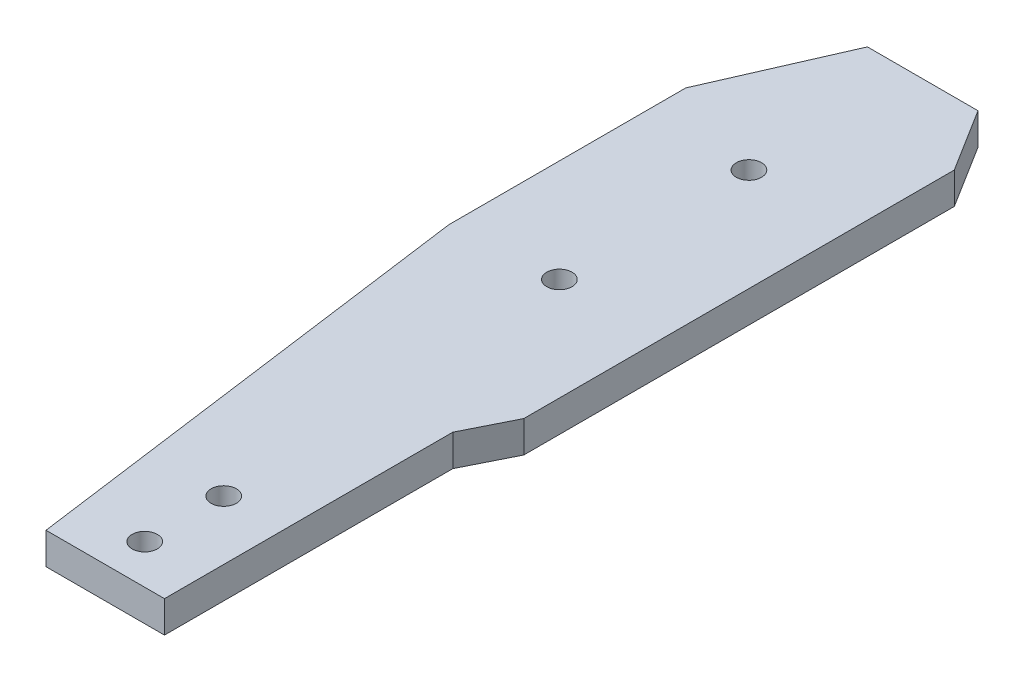
ISO-10303-21;
HEADER;
FILE_DESCRIPTION(('STEP AP214'),'2;1');
FILE_NAME('part.step','',(''),(''),'','','');
FILE_SCHEMA(('AUTOMOTIVE_DESIGN { 1 0 10303 214 1 1 1 1 }'));
ENDSEC;
DATA;
#1=APPLICATION_CONTEXT('core data for automotive mechanical design processes');
#2=APPLICATION_PROTOCOL_DEFINITION('international standard','automotive_design',2000,#1);
#3=PRODUCT_CONTEXT('',#1,'mechanical');
#4=PRODUCT('Part','Part','',(#3));
#5=PRODUCT_RELATED_PRODUCT_CATEGORY('part','',(#4));
#6=PRODUCT_DEFINITION_FORMATION('','',#4);
#7=PRODUCT_DEFINITION_CONTEXT('part definition',#1,'design');
#8=PRODUCT_DEFINITION('design','',#6,#7);
#9=PRODUCT_DEFINITION_SHAPE('','',#8);
#10=(LENGTH_UNIT() NAMED_UNIT(*) SI_UNIT(.MILLI.,.METRE.));
#11=(NAMED_UNIT(*) PLANE_ANGLE_UNIT() SI_UNIT($,.RADIAN.));
#12=(NAMED_UNIT(*) SI_UNIT($,.STERADIAN.) SOLID_ANGLE_UNIT());
#13=UNCERTAINTY_MEASURE_WITH_UNIT(LENGTH_MEASURE(1.E-05),#10,'distance_accuracy_value','');
#14=(GEOMETRIC_REPRESENTATION_CONTEXT(3) GLOBAL_UNCERTAINTY_ASSIGNED_CONTEXT((#13)) GLOBAL_UNIT_ASSIGNED_CONTEXT((#10,
#11,#12)) REPRESENTATION_CONTEXT('',''));
#15=CARTESIAN_POINT('',(0.,0.,0.));
#16=DIRECTION('',(0.,0.,1.));
#17=DIRECTION('',(1.,0.,0.));
#18=AXIS2_PLACEMENT_3D('',#15,#16,#17);
#19=CARTESIAN_POINT('',(0.,4.,0.));
#20=DIRECTION('',(0.916157334902189,0.,0.400818834019707));
#21=DIRECTION('',(0.400818834019707,0.,-0.916157334902189));
#22=AXIS2_PLACEMENT_3D('',#19,#20,#21);
#23=PLANE('',#22);
#24=DIRECTION('',(-0.400818834019707,0.,0.916157334902189));
#25=VECTOR('',#24,1.);
#26=CARTESIAN_POINT('',(0.,0.,0.));
#27=LINE('',#26,#25);
#28=CARTESIAN_POINT('',(0.,0.,0.));
#29=VERTEX_POINT('',#28);
#30=CARTESIAN_POINT('',(-6.99999999999999,0.,16.));
#31=VERTEX_POINT('',#30);
#32=EDGE_CURVE('E145',#29,#31,#27,.T.);
#33=ORIENTED_EDGE('',*,*,#32,.T.);
#34=DIRECTION('',(0.,-1.,0.));
#35=VECTOR('',#34,1.);
#36=CARTESIAN_POINT('',(-6.99999999999999,4.,16.));
#37=LINE('',#36,#35);
#38=CARTESIAN_POINT('',(-6.99999999999999,4.,16.));
#39=VERTEX_POINT('',#38);
#40=EDGE_CURVE('E11',#39,#31,#37,.T.);
#41=ORIENTED_EDGE('',*,*,#40,.F.);
#42=DIRECTION('',(-0.400818834019707,0.,0.916157334902189));
#43=VECTOR('',#42,1.);
#44=CARTESIAN_POINT('',(0.,4.,0.));
#45=LINE('',#44,#43);
#46=CARTESIAN_POINT('',(0.,4.,0.));
#47=VERTEX_POINT('',#46);
#48=EDGE_CURVE('E171',#47,#39,#45,.T.);
#49=ORIENTED_EDGE('',*,*,#48,.F.);
#50=DIRECTION('',(0.,-1.,0.));
#51=VECTOR('',#50,1.);
#52=CARTESIAN_POINT('',(0.,4.,0.));
#53=LINE('',#52,#51);
#54=EDGE_CURVE('E141',#47,#29,#53,.T.);
#55=ORIENTED_EDGE('',*,*,#54,.T.);
#56=EDGE_LOOP('',(#33,#41,#49,#55));
#57=FACE_BOUND('',#56,.T.);
#58=ADVANCED_FACE('F38',(#57),#23,.F.);
#59=CARTESIAN_POINT('',(-6.99999999999999,4.,16.));
#60=DIRECTION('',(1.,0.,0.));
#61=DIRECTION('',(0.,0.,-1.));
#62=AXIS2_PLACEMENT_3D('',#59,#60,#61);
#63=PLANE('',#62);
#64=DIRECTION('',(0.,0.,1.));
#65=VECTOR('',#64,1.);
#66=CARTESIAN_POINT('',(-6.99999999999999,0.,16.));
#67=LINE('',#66,#65);
#68=CARTESIAN_POINT('',(-6.99999999999999,0.,46.));
#69=VERTEX_POINT('',#68);
#70=EDGE_CURVE('E149',#31,#69,#67,.T.);
#71=ORIENTED_EDGE('',*,*,#70,.T.);
#72=DIRECTION('',(0.,-1.,0.));
#73=VECTOR('',#72,1.);
#74=CARTESIAN_POINT('',(-6.99999999999999,4.,46.));
#75=LINE('',#74,#73);
#76=CARTESIAN_POINT('',(-6.99999999999999,4.,46.));
#77=VERTEX_POINT('',#76);
#78=EDGE_CURVE('E47',#77,#69,#75,.T.);
#79=ORIENTED_EDGE('',*,*,#78,.F.);
#80=DIRECTION('',(0.,0.,1.));
#81=VECTOR('',#80,1.);
#82=CARTESIAN_POINT('',(-6.99999999999999,4.,16.));
#83=LINE('',#82,#81);
#84=EDGE_CURVE('E101',#39,#77,#83,.T.);
#85=ORIENTED_EDGE('',*,*,#84,.F.);
#86=ORIENTED_EDGE('',*,*,#40,.T.);
#87=EDGE_LOOP('',(#71,#79,#85,#86));
#88=FACE_BOUND('',#87,.T.);
#89=ADVANCED_FACE('F291',(#88),#63,.F.);
#90=CARTESIAN_POINT('',(-6.99999999999999,4.,46.));
#91=DIRECTION('',(0.990932088180138,0.,-0.134363672973578));
#92=DIRECTION('',(-0.134363672973578,0.,-0.990932088180138));
#93=AXIS2_PLACEMENT_3D('',#90,#91,#92);
#94=PLANE('',#93);
#95=DIRECTION('',(0.134363672973578,0.,0.990932088180138));
#96=VECTOR('',#95,1.);
#97=CARTESIAN_POINT('',(-6.99999999999999,0.,46.));
#98=LINE('',#97,#96);
#99=CARTESIAN_POINT('',(1.00000000000001,0.,105.));
#100=VERTEX_POINT('',#99);
#101=EDGE_CURVE('E153',#69,#100,#98,.T.);
#102=ORIENTED_EDGE('',*,*,#101,.T.);
#103=DIRECTION('',(0.,-1.,0.));
#104=VECTOR('',#103,1.);
#105=CARTESIAN_POINT('',(1.00000000000001,4.,105.));
#106=LINE('',#105,#104);
#107=CARTESIAN_POINT('',(1.00000000000001,4.,105.));
#108=VERTEX_POINT('',#107);
#109=EDGE_CURVE('E186',#108,#100,#106,.T.);
#110=ORIENTED_EDGE('',*,*,#109,.F.);
#111=DIRECTION('',(0.134363672973578,0.,0.990932088180138));
#112=VECTOR('',#111,1.);
#113=CARTESIAN_POINT('',(-6.99999999999999,4.,46.));
#114=LINE('',#113,#112);
#115=EDGE_CURVE('E196',#77,#108,#114,.T.);
#116=ORIENTED_EDGE('',*,*,#115,.F.);
#117=ORIENTED_EDGE('',*,*,#78,.T.);
#118=EDGE_LOOP('',(#102,#110,#116,#117));
#119=FACE_BOUND('',#118,.T.);
#120=ADVANCED_FACE('F194',(#119),#94,.F.);
#121=CARTESIAN_POINT('',(1.00000000000001,4.,105.));
#122=DIRECTION('',(0.,0.,-1.));
#123=DIRECTION('',(-1.,0.,0.));
#124=AXIS2_PLACEMENT_3D('',#121,#122,#123);
#125=PLANE('',#124);
#126=DIRECTION('',(1.,0.,0.));
#127=VECTOR('',#126,1.);
#128=CARTESIAN_POINT('',(1.00000000000001,0.,105.));
#129=LINE('',#128,#127);
#130=CARTESIAN_POINT('',(16.,0.,105.));
#131=VERTEX_POINT('',#130);
#132=EDGE_CURVE('E156',#100,#131,#129,.T.);
#133=ORIENTED_EDGE('',*,*,#132,.T.);
#134=DIRECTION('',(0.,-1.,0.));
#135=VECTOR('',#134,1.);
#136=CARTESIAN_POINT('',(16.,4.,105.));
#137=LINE('',#136,#135);
#138=CARTESIAN_POINT('',(16.,4.,105.));
#139=VERTEX_POINT('',#138);
#140=EDGE_CURVE('E182',#139,#131,#137,.T.);
#141=ORIENTED_EDGE('',*,*,#140,.F.);
#142=DIRECTION('',(1.,0.,0.));
#143=VECTOR('',#142,1.);
#144=CARTESIAN_POINT('',(1.00000000000001,4.,105.));
#145=LINE('',#144,#143);
#146=EDGE_CURVE('E213',#108,#139,#145,.T.);
#147=ORIENTED_EDGE('',*,*,#146,.F.);
#148=ORIENTED_EDGE('',*,*,#109,.T.);
#149=EDGE_LOOP('',(#133,#141,#147,#148));
#150=FACE_BOUND('',#149,.T.);
#151=ADVANCED_FACE('F205',(#150),#125,.F.);
#152=CARTESIAN_POINT('',(16.,4.,105.));
#153=DIRECTION('',(-1.,0.,0.));
#154=DIRECTION('',(0.,0.,1.));
#155=AXIS2_PLACEMENT_3D('',#152,#153,#154);
#156=PLANE('',#155);
#157=DIRECTION('',(0.,0.,-1.));
#158=VECTOR('',#157,1.);
#159=CARTESIAN_POINT('',(16.,0.,105.));
#160=LINE('',#159,#158);
#161=CARTESIAN_POINT('',(16.,0.,68.5));
#162=VERTEX_POINT('',#161);
#163=EDGE_CURVE('E159',#131,#162,#160,.T.);
#164=ORIENTED_EDGE('',*,*,#163,.T.);
#165=DIRECTION('',(0.,-1.,0.));
#166=VECTOR('',#165,1.);
#167=CARTESIAN_POINT('',(16.,4.,68.5));
#168=LINE('',#167,#166);
#169=CARTESIAN_POINT('',(16.,4.,68.5));
#170=VERTEX_POINT('',#169);
#171=EDGE_CURVE('E178',#170,#162,#168,.T.);
#172=ORIENTED_EDGE('',*,*,#171,.F.);
#173=DIRECTION('',(0.,0.,-1.));
#174=VECTOR('',#173,1.);
#175=CARTESIAN_POINT('',(16.,4.,105.));
#176=LINE('',#175,#174);
#177=EDGE_CURVE('E211',#139,#170,#176,.T.);
#178=ORIENTED_EDGE('',*,*,#177,.F.);
#179=ORIENTED_EDGE('',*,*,#140,.T.);
#180=EDGE_LOOP('',(#164,#172,#178,#179));
#181=FACE_BOUND('',#180,.T.);
#182=ADVANCED_FACE('F209',(#181),#156,.F.);
#183=CARTESIAN_POINT('',(16.,4.,68.5));
#184=DIRECTION('',(-0.894427190999916,0.,-0.447213595499958));
#185=DIRECTION('',(-0.447213595499958,0.,0.894427190999916));
#186=AXIS2_PLACEMENT_3D('',#183,#184,#185);
#187=PLANE('',#186);
#188=DIRECTION('',(0.447213595499958,0.,-0.894427190999916));
#189=VECTOR('',#188,1.);
#190=CARTESIAN_POINT('',(16.,0.,68.5));
#191=LINE('',#190,#189);
#192=CARTESIAN_POINT('',(19.,0.,62.5));
#193=VERTEX_POINT('',#192);
#194=EDGE_CURVE('E162',#162,#193,#191,.T.);
#195=ORIENTED_EDGE('',*,*,#194,.T.);
#196=DIRECTION('',(0.,-1.,0.));
#197=VECTOR('',#196,1.);
#198=CARTESIAN_POINT('',(19.,4.,62.5));
#199=LINE('',#198,#197);
#200=CARTESIAN_POINT('',(19.,4.,62.5));
#201=VERTEX_POINT('',#200);
#202=EDGE_CURVE('E134',#201,#193,#199,.T.);
#203=ORIENTED_EDGE('',*,*,#202,.F.);
#204=DIRECTION('',(0.447213595499958,0.,-0.894427190999916));
#205=VECTOR('',#204,1.);
#206=CARTESIAN_POINT('',(16.,4.,68.5));
#207=LINE('',#206,#205);
#208=EDGE_CURVE('E123',#170,#201,#207,.T.);
#209=ORIENTED_EDGE('',*,*,#208,.F.);
#210=ORIENTED_EDGE('',*,*,#171,.T.);
#211=EDGE_LOOP('',(#195,#203,#209,#210));
#212=FACE_BOUND('',#211,.T.);
#213=ADVANCED_FACE('F299',(#212),#187,.F.);
#214=CARTESIAN_POINT('',(19.,4.,62.5));
#215=DIRECTION('',(-1.,0.,0.));
#216=DIRECTION('',(0.,0.,1.));
#217=AXIS2_PLACEMENT_3D('',#214,#215,#216);
#218=PLANE('',#217);
#219=DIRECTION('',(0.,0.,-1.));
#220=VECTOR('',#219,1.);
#221=CARTESIAN_POINT('',(19.,0.,62.5));
#222=LINE('',#221,#220);
#223=CARTESIAN_POINT('',(19.,0.,7.99999999999999));
#224=VERTEX_POINT('',#223);
#225=EDGE_CURVE('E132',#193,#224,#222,.T.);
#226=ORIENTED_EDGE('',*,*,#225,.T.);
#227=DIRECTION('',(0.,-1.,0.));
#228=VECTOR('',#227,1.);
#229=CARTESIAN_POINT('',(19.,4.,7.99999999999999));
#230=LINE('',#229,#228);
#231=CARTESIAN_POINT('',(19.,4.,7.99999999999999));
#232=VERTEX_POINT('',#231);
#233=EDGE_CURVE('E129',#232,#224,#230,.T.);
#234=ORIENTED_EDGE('',*,*,#233,.F.);
#235=DIRECTION('',(0.,0.,-1.));
#236=VECTOR('',#235,1.);
#237=CARTESIAN_POINT('',(19.,4.,62.5));
#238=LINE('',#237,#236);
#239=EDGE_CURVE('E117',#201,#232,#238,.T.);
#240=ORIENTED_EDGE('',*,*,#239,.F.);
#241=ORIENTED_EDGE('',*,*,#202,.T.);
#242=EDGE_LOOP('',(#226,#234,#240,#241));
#243=FACE_BOUND('',#242,.T.);
#244=ADVANCED_FACE('F130',(#243),#218,.F.);
#245=CARTESIAN_POINT('',(19.,4.,7.99999999999999));
#246=DIRECTION('',(-0.847998304005088,0.,0.529998940003181));
#247=DIRECTION('',(0.529998940003181,0.,0.847998304005088));
#248=AXIS2_PLACEMENT_3D('',#245,#246,#247);
#249=PLANE('',#248);
#250=DIRECTION('',(-0.529998940003181,0.,-0.847998304005088));
#251=VECTOR('',#250,1.);
#252=CARTESIAN_POINT('',(19.,0.,7.99999999999999));
#253=LINE('',#252,#251);
#254=CARTESIAN_POINT('',(14.,0.,0.));
#255=VERTEX_POINT('',#254);
#256=EDGE_CURVE('E87',#224,#255,#253,.T.);
#257=ORIENTED_EDGE('',*,*,#256,.T.);
#258=DIRECTION('',(0.,-1.,0.));
#259=VECTOR('',#258,1.);
#260=CARTESIAN_POINT('',(14.,4.,0.));
#261=LINE('',#260,#259);
#262=CARTESIAN_POINT('',(14.,4.,0.));
#263=VERTEX_POINT('',#262);
#264=EDGE_CURVE('E135',#263,#255,#261,.T.);
#265=ORIENTED_EDGE('',*,*,#264,.F.);
#266=DIRECTION('',(-0.529998940003181,0.,-0.847998304005088));
#267=VECTOR('',#266,1.);
#268=CARTESIAN_POINT('',(19.,4.,7.99999999999999));
#269=LINE('',#268,#267);
#270=EDGE_CURVE('E121',#232,#263,#269,.T.);
#271=ORIENTED_EDGE('',*,*,#270,.F.);
#272=ORIENTED_EDGE('',*,*,#233,.T.);
#273=EDGE_LOOP('',(#257,#265,#271,#272));
#274=FACE_BOUND('',#273,.T.);
#275=ADVANCED_FACE('F137',(#274),#249,.F.);
#276=CARTESIAN_POINT('',(14.,4.,0.));
#277=DIRECTION('',(0.,0.,1.));
#278=DIRECTION('',(1.,0.,0.));
#279=AXIS2_PLACEMENT_3D('',#276,#277,#278);
#280=PLANE('',#279);
#281=DIRECTION('',(-1.,0.,0.));
#282=VECTOR('',#281,1.);
#283=CARTESIAN_POINT('',(14.,0.,0.));
#284=LINE('',#283,#282);
#285=EDGE_CURVE('E93',#255,#29,#284,.T.);
#286=ORIENTED_EDGE('',*,*,#285,.T.);
#287=ORIENTED_EDGE('',*,*,#54,.F.);
#288=DIRECTION('',(-1.,0.,0.));
#289=VECTOR('',#288,1.);
#290=CARTESIAN_POINT('',(14.,4.,0.));
#291=LINE('',#290,#289);
#292=EDGE_CURVE('E55',#263,#47,#291,.T.);
#293=ORIENTED_EDGE('',*,*,#292,.F.);
#294=ORIENTED_EDGE('',*,*,#264,.T.);
#295=EDGE_LOOP('',(#286,#287,#293,#294));
#296=FACE_BOUND('',#295,.T.);
#297=ADVANCED_FACE('F268',(#296),#280,.F.);
#298=CARTESIAN_POINT('',(0.,4.,0.));
#299=DIRECTION('',(0.,1.,0.));
#300=DIRECTION('',(0.,0.,1.));
#301=AXIS2_PLACEMENT_3D('',#298,#299,#300);
#302=PLANE('',#301);
#303=CARTESIAN_POINT('',(6.00000000000001,4.,21.));
#304=DIRECTION('',(0.,1.,0.));
#305=DIRECTION('',(0.,0.,1.));
#306=AXIS2_PLACEMENT_3D('',#303,#304,#305);
#307=CIRCLE('',#306,1.6);
#308=CARTESIAN_POINT('',(6.00000000000001,4.,22.6));
#309=VERTEX_POINT('',#308);
#310=EDGE_CURVE('E249',#309,#309,#307,.T.);
#311=ORIENTED_EDGE('',*,*,#310,.F.);
#312=EDGE_LOOP('',(#311));
#313=FACE_BOUND('',#312,.T.);
#314=CARTESIAN_POINT('',(6.00000000000001,4.,45.));
#315=DIRECTION('',(0.,1.,0.));
#316=DIRECTION('',(0.,0.,1.));
#317=AXIS2_PLACEMENT_3D('',#314,#315,#316);
#318=CIRCLE('',#317,1.6);
#319=CARTESIAN_POINT('',(6.00000000000001,4.,46.6));
#320=VERTEX_POINT('',#319);
#321=EDGE_CURVE('E241',#320,#320,#318,.T.);
#322=ORIENTED_EDGE('',*,*,#321,.F.);
#323=EDGE_LOOP('',(#322));
#324=FACE_BOUND('',#323,.T.);
#325=CARTESIAN_POINT('',(8.50000000000001,4.,90.));
#326=DIRECTION('',(0.,1.,0.));
#327=DIRECTION('',(0.,0.,1.));
#328=AXIS2_PLACEMENT_3D('',#325,#326,#327);
#329=CIRCLE('',#328,1.6);
#330=CARTESIAN_POINT('',(8.50000000000001,4.,91.6));
#331=VERTEX_POINT('',#330);
#332=EDGE_CURVE('E233',#331,#331,#329,.T.);
#333=ORIENTED_EDGE('',*,*,#332,.F.);
#334=EDGE_LOOP('',(#333));
#335=FACE_BOUND('',#334,.T.);
#336=CARTESIAN_POINT('',(8.50000000000001,4.,100.));
#337=DIRECTION('',(0.,1.,0.));
#338=DIRECTION('',(0.,0.,1.));
#339=AXIS2_PLACEMENT_3D('',#336,#337,#338);
#340=CIRCLE('',#339,1.6);
#341=CARTESIAN_POINT('',(8.50000000000001,4.,101.6));
#342=VERTEX_POINT('',#341);
#343=EDGE_CURVE('E225',#342,#342,#340,.T.);
#344=ORIENTED_EDGE('',*,*,#343,.F.);
#345=EDGE_LOOP('',(#344));
#346=FACE_BOUND('',#345,.T.);
#347=ORIENTED_EDGE('',*,*,#48,.T.);
#348=ORIENTED_EDGE('',*,*,#84,.T.);
#349=ORIENTED_EDGE('',*,*,#115,.T.);
#350=ORIENTED_EDGE('',*,*,#146,.T.);
#351=ORIENTED_EDGE('',*,*,#177,.T.);
#352=ORIENTED_EDGE('',*,*,#208,.T.);
#353=ORIENTED_EDGE('',*,*,#239,.T.);
#354=ORIENTED_EDGE('',*,*,#270,.T.);
#355=ORIENTED_EDGE('',*,*,#292,.T.);
#356=EDGE_LOOP('',(#347,#348,#349,#350,#351,#352,#353,#354,#355));
#357=FACE_BOUND('',#356,.T.);
#358=ADVANCED_FACE('F119',(#313,#324,#335,#346,#357),#302,.T.);
#359=CARTESIAN_POINT('',(0.,0.,0.));
#360=DIRECTION('',(0.,1.,0.));
#361=DIRECTION('',(0.,0.,1.));
#362=AXIS2_PLACEMENT_3D('',#359,#360,#361);
#363=PLANE('',#362);
#364=CARTESIAN_POINT('',(6.00000000000001,0.,21.));
#365=DIRECTION('',(0.,1.,0.));
#366=DIRECTION('',(0.,0.,1.));
#367=AXIS2_PLACEMENT_3D('',#364,#365,#366);
#368=CIRCLE('',#367,1.6);
#369=CARTESIAN_POINT('',(6.00000000000001,0.,22.6));
#370=VERTEX_POINT('',#369);
#371=EDGE_CURVE('E150',#370,#370,#368,.T.);
#372=ORIENTED_EDGE('',*,*,#371,.T.);
#373=EDGE_LOOP('',(#372));
#374=FACE_BOUND('',#373,.T.);
#375=CARTESIAN_POINT('',(6.00000000000001,0.,45.));
#376=DIRECTION('',(0.,1.,0.));
#377=DIRECTION('',(0.,0.,1.));
#378=AXIS2_PLACEMENT_3D('',#375,#376,#377);
#379=CIRCLE('',#378,1.6);
#380=CARTESIAN_POINT('',(6.00000000000001,0.,46.6));
#381=VERTEX_POINT('',#380);
#382=EDGE_CURVE('E245',#381,#381,#379,.T.);
#383=ORIENTED_EDGE('',*,*,#382,.T.);
#384=EDGE_LOOP('',(#383));
#385=FACE_BOUND('',#384,.T.);
#386=CARTESIAN_POINT('',(8.50000000000001,0.,90.));
#387=DIRECTION('',(0.,1.,0.));
#388=DIRECTION('',(0.,0.,1.));
#389=AXIS2_PLACEMENT_3D('',#386,#387,#388);
#390=CIRCLE('',#389,1.6);
#391=CARTESIAN_POINT('',(8.50000000000001,0.,91.6));
#392=VERTEX_POINT('',#391);
#393=EDGE_CURVE('E237',#392,#392,#390,.T.);
#394=ORIENTED_EDGE('',*,*,#393,.T.);
#395=EDGE_LOOP('',(#394));
#396=FACE_BOUND('',#395,.T.);
#397=CARTESIAN_POINT('',(8.50000000000001,0.,100.));
#398=DIRECTION('',(0.,1.,0.));
#399=DIRECTION('',(0.,0.,1.));
#400=AXIS2_PLACEMENT_3D('',#397,#398,#399);
#401=CIRCLE('',#400,1.6);
#402=CARTESIAN_POINT('',(8.50000000000001,0.,101.6));
#403=VERTEX_POINT('',#402);
#404=EDGE_CURVE('E229',#403,#403,#401,.T.);
#405=ORIENTED_EDGE('',*,*,#404,.T.);
#406=EDGE_LOOP('',(#405));
#407=FACE_BOUND('',#406,.T.);
#408=ORIENTED_EDGE('',*,*,#32,.F.);
#409=ORIENTED_EDGE('',*,*,#285,.F.);
#410=ORIENTED_EDGE('',*,*,#256,.F.);
#411=ORIENTED_EDGE('',*,*,#225,.F.);
#412=ORIENTED_EDGE('',*,*,#194,.F.);
#413=ORIENTED_EDGE('',*,*,#163,.F.);
#414=ORIENTED_EDGE('',*,*,#132,.F.);
#415=ORIENTED_EDGE('',*,*,#101,.F.);
#416=ORIENTED_EDGE('',*,*,#70,.F.);
#417=EDGE_LOOP('',(#408,#409,#410,#411,#412,#413,#414,#415,#416));
#418=FACE_BOUND('',#417,.T.);
#419=ADVANCED_FACE('F200',(#374,#385,#396,#407,#418),#363,.F.);
#420=CARTESIAN_POINT('',(8.50000000000001,0.,100.));
#421=DIRECTION('',(0.,1.,0.));
#422=DIRECTION('',(0.,0.,1.));
#423=AXIS2_PLACEMENT_3D('',#420,#421,#422);
#424=CYLINDRICAL_SURFACE('',#423,1.6);
#425=ORIENTED_EDGE('',*,*,#404,.F.);
#426=EDGE_LOOP('',(#425));
#427=FACE_BOUND('',#426,.T.);
#428=ORIENTED_EDGE('',*,*,#343,.T.);
#429=EDGE_LOOP('',(#428));
#430=FACE_BOUND('',#429,.T.);
#431=ADVANCED_FACE('F276',(#427,#430),#424,.F.);
#432=CARTESIAN_POINT('',(8.50000000000001,0.,90.));
#433=DIRECTION('',(0.,1.,0.));
#434=DIRECTION('',(0.,0.,1.));
#435=AXIS2_PLACEMENT_3D('',#432,#433,#434);
#436=CYLINDRICAL_SURFACE('',#435,1.6);
#437=ORIENTED_EDGE('',*,*,#393,.F.);
#438=EDGE_LOOP('',(#437));
#439=FACE_BOUND('',#438,.T.);
#440=ORIENTED_EDGE('',*,*,#332,.T.);
#441=EDGE_LOOP('',(#440));
#442=FACE_BOUND('',#441,.T.);
#443=ADVANCED_FACE('F278',(#439,#442),#436,.F.);
#444=CARTESIAN_POINT('',(6.00000000000001,0.,45.));
#445=DIRECTION('',(0.,1.,0.));
#446=DIRECTION('',(0.,0.,1.));
#447=AXIS2_PLACEMENT_3D('',#444,#445,#446);
#448=CYLINDRICAL_SURFACE('',#447,1.6);
#449=ORIENTED_EDGE('',*,*,#382,.F.);
#450=EDGE_LOOP('',(#449));
#451=FACE_BOUND('',#450,.T.);
#452=ORIENTED_EDGE('',*,*,#321,.T.);
#453=EDGE_LOOP('',(#452));
#454=FACE_BOUND('',#453,.T.);
#455=ADVANCED_FACE('F262',(#451,#454),#448,.F.);
#456=CARTESIAN_POINT('',(6.00000000000001,0.,21.));
#457=DIRECTION('',(0.,1.,0.));
#458=DIRECTION('',(0.,0.,1.));
#459=AXIS2_PLACEMENT_3D('',#456,#457,#458);
#460=CYLINDRICAL_SURFACE('',#459,1.6);
#461=ORIENTED_EDGE('',*,*,#371,.F.);
#462=EDGE_LOOP('',(#461));
#463=FACE_BOUND('',#462,.T.);
#464=ORIENTED_EDGE('',*,*,#310,.T.);
#465=EDGE_LOOP('',(#464));
#466=FACE_BOUND('',#465,.T.);
#467=ADVANCED_FACE('F259',(#463,#466),#460,.F.);
#468=CLOSED_SHELL('',(#58,#89,#120,#151,#182,#213,#244,#275,#297,#358,#419,#431,#443,#455,#467));
#469=MANIFOLD_SOLID_BREP('B2',#468);
#470=ADVANCED_BREP_SHAPE_REPRESENTATION('',(#18,#469),#14);
#471=SHAPE_DEFINITION_REPRESENTATION(#9,#470);
ENDSEC;
END-ISO-10303-21;
